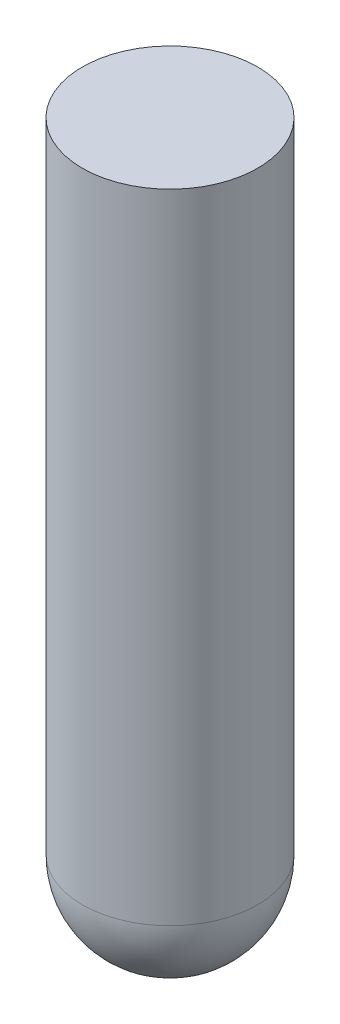
ISO-10303-21;
HEADER;
FILE_DESCRIPTION(('STEP AP214'),'2;1');
FILE_NAME('part.step','',(''),(''),'','','');
FILE_SCHEMA(('AUTOMOTIVE_DESIGN { 1 0 10303 214 1 1 1 1 }'));
ENDSEC;
DATA;
#1=APPLICATION_CONTEXT('core data for automotive mechanical design processes');
#2=APPLICATION_PROTOCOL_DEFINITION('international standard','automotive_design',2000,#1);
#3=PRODUCT_CONTEXT('',#1,'mechanical');
#4=PRODUCT('Part','Part','',(#3));
#5=PRODUCT_RELATED_PRODUCT_CATEGORY('part','',(#4));
#6=PRODUCT_DEFINITION_FORMATION('','',#4);
#7=PRODUCT_DEFINITION_CONTEXT('part definition',#1,'design');
#8=PRODUCT_DEFINITION('design','',#6,#7);
#9=PRODUCT_DEFINITION_SHAPE('','',#8);
#10=(LENGTH_UNIT() NAMED_UNIT(*) SI_UNIT(.MILLI.,.METRE.));
#11=(NAMED_UNIT(*) PLANE_ANGLE_UNIT() SI_UNIT($,.RADIAN.));
#12=(NAMED_UNIT(*) SI_UNIT($,.STERADIAN.) SOLID_ANGLE_UNIT());
#13=UNCERTAINTY_MEASURE_WITH_UNIT(LENGTH_MEASURE(1.E-05),#10,'distance_accuracy_value','');
#14=(GEOMETRIC_REPRESENTATION_CONTEXT(3) GLOBAL_UNCERTAINTY_ASSIGNED_CONTEXT((#13)) GLOBAL_UNIT_ASSIGNED_CONTEXT((#10,
#11,#12)) REPRESENTATION_CONTEXT('',''));
#15=CARTESIAN_POINT('',(0.,0.,0.));
#16=DIRECTION('',(0.,0.,1.));
#17=DIRECTION('',(1.,0.,0.));
#18=AXIS2_PLACEMENT_3D('',#15,#16,#17);
#19=CARTESIAN_POINT('',(0.,4.,0.));
#20=DIRECTION('',(0.,1.,0.));
#21=DIRECTION('',(1.,0.,0.));
#22=AXIS2_PLACEMENT_3D('',#19,#20,#21);
#23=PLANE('',#22);
#24=CARTESIAN_POINT('',(0.,4.,0.));
#25=DIRECTION('',(0.,1.,0.));
#26=DIRECTION('',(0.,0.,1.));
#27=AXIS2_PLACEMENT_3D('',#24,#25,#26);
#28=CIRCLE('',#27,0.55);
#29=CARTESIAN_POINT('',(0.,4.,0.55));
#30=VERTEX_POINT('',#29);
#31=EDGE_CURVE('E11',#30,#30,#28,.T.);
#32=ORIENTED_EDGE('',*,*,#31,.T.);
#33=EDGE_LOOP('',(#32));
#34=FACE_BOUND('',#33,.T.);
#35=ADVANCED_FACE('F16',(#34),#23,.T.);
#36=CARTESIAN_POINT('',(0.,4.,0.));
#37=DIRECTION('',(0.,-1.,0.));
#38=DIRECTION('',(0.,0.,-1.));
#39=AXIS2_PLACEMENT_3D('',#36,#37,#38);
#40=CYLINDRICAL_SURFACE('',#39,0.55);
#41=CARTESIAN_POINT('',(0.,0.,0.));
#42=DIRECTION('',(0.,-1.,0.));
#43=DIRECTION('',(0.,0.,1.));
#44=AXIS2_PLACEMENT_3D('',#41,#42,#43);
#45=CIRCLE('',#44,0.55);
#46=CARTESIAN_POINT('',(0.,0.,0.55));
#47=VERTEX_POINT('',#46);
#48=EDGE_CURVE('E49',#47,#47,#45,.T.);
#49=ORIENTED_EDGE('',*,*,#48,.F.);
#50=DIRECTION('',(0.,1.,0.));
#51=VECTOR('',#50,1.);
#52=CARTESIAN_POINT('',(0.,4.,0.55));
#53=LINE('',#52,#51);
#54=EDGE_CURVE('E25',#47,#30,#53,.T.);
#55=ORIENTED_EDGE('',*,*,#54,.T.);
#56=ORIENTED_EDGE('',*,*,#31,.F.);
#57=ORIENTED_EDGE('',*,*,#54,.F.);
#58=EDGE_LOOP('',(#49,#55,#56,#57));
#59=FACE_BOUND('',#58,.T.);
#60=ADVANCED_FACE('F18',(#59),#40,.T.);
#61=CARTESIAN_POINT('',(0.,0.,0.));
#62=DIRECTION('',(0.,1.,0.));
#63=DIRECTION('',(0.,0.,-1.));
#64=AXIS2_PLACEMENT_3D('',#61,#62,#63);
#65=SPHERICAL_SURFACE('',#64,0.55);
#66=ORIENTED_EDGE('',*,*,#48,.T.);
#67=CARTESIAN_POINT('',(0.,0.,0.));
#68=DIRECTION('',(1.,0.,0.));
#69=DIRECTION('',(0.,0.,1.));
#70=AXIS2_PLACEMENT_3D('',#67,#68,#69);
#71=CIRCLE('',#70,0.55);
#72=CARTESIAN_POINT('',(0.,-0.55,0.));
#73=VERTEX_POINT('',#72);
#74=EDGE_CURVE('E43',#47,#73,#71,.T.);
#75=ORIENTED_EDGE('',*,*,#74,.T.);
#76=ORIENTED_EDGE('',*,*,#74,.F.);
#77=EDGE_LOOP('',(#66,#75,#76));
#78=FACE_BOUND('',#77,.T.);
#79=ADVANCED_FACE('F52',(#78),#65,.T.);
#80=CLOSED_SHELL('',(#35,#60,#79));
#81=MANIFOLD_SOLID_BREP('B1',#80);
#82=ADVANCED_BREP_SHAPE_REPRESENTATION('',(#18,#81),#14);
#83=SHAPE_DEFINITION_REPRESENTATION(#9,#82);
ENDSEC;
END-ISO-10303-21;
